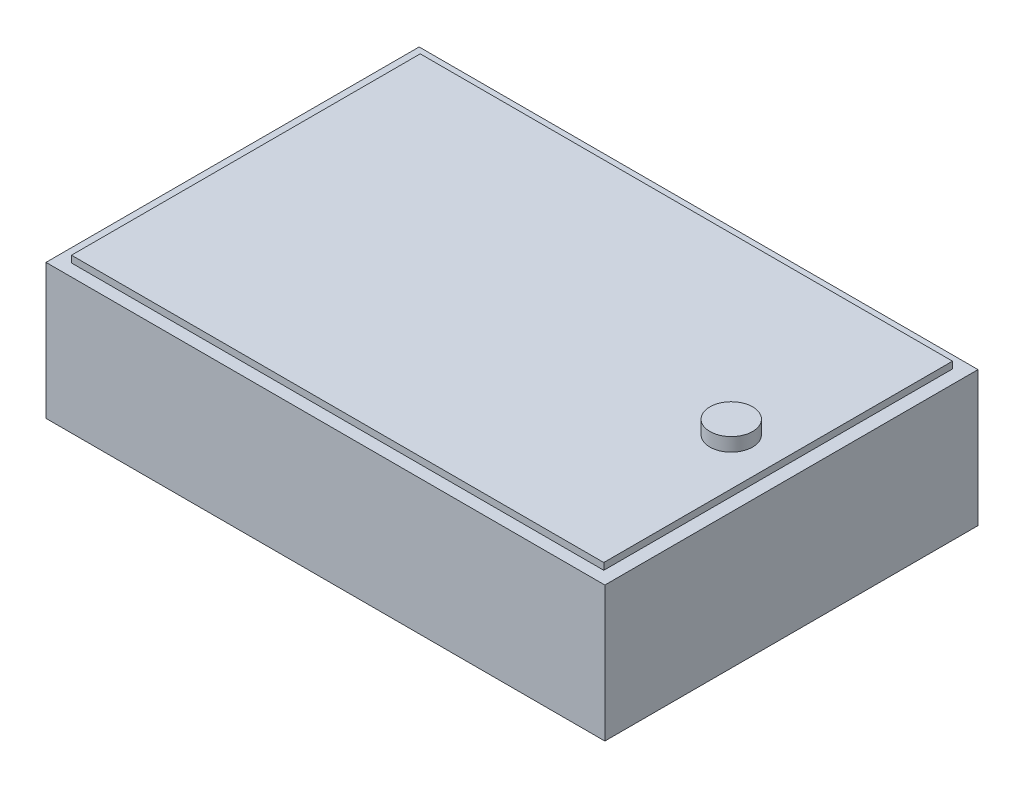
ISO-10303-21;
HEADER;
FILE_DESCRIPTION(('STEP AP214'),'2;1');
FILE_NAME('part.step','',(''),(''),'','','');
FILE_SCHEMA(('AUTOMOTIVE_DESIGN { 1 0 10303 214 1 1 1 1 }'));
ENDSEC;
DATA;
#1=APPLICATION_CONTEXT('core data for automotive mechanical design processes');
#2=APPLICATION_PROTOCOL_DEFINITION('international standard','automotive_design',2000,#1);
#3=PRODUCT_CONTEXT('',#1,'mechanical');
#4=PRODUCT('Part','Part','',(#3));
#5=PRODUCT_RELATED_PRODUCT_CATEGORY('part','',(#4));
#6=PRODUCT_DEFINITION_FORMATION('','',#4);
#7=PRODUCT_DEFINITION_CONTEXT('part definition',#1,'design');
#8=PRODUCT_DEFINITION('design','',#6,#7);
#9=PRODUCT_DEFINITION_SHAPE('','',#8);
#10=(LENGTH_UNIT() NAMED_UNIT(*) SI_UNIT(.MILLI.,.METRE.));
#11=(NAMED_UNIT(*) PLANE_ANGLE_UNIT() SI_UNIT($,.RADIAN.));
#12=(NAMED_UNIT(*) SI_UNIT($,.STERADIAN.) SOLID_ANGLE_UNIT());
#13=UNCERTAINTY_MEASURE_WITH_UNIT(LENGTH_MEASURE(1.E-05),#10,'distance_accuracy_value','');
#14=(GEOMETRIC_REPRESENTATION_CONTEXT(3) GLOBAL_UNCERTAINTY_ASSIGNED_CONTEXT((#13)) GLOBAL_UNIT_ASSIGNED_CONTEXT((#10,
#11,#12)) REPRESENTATION_CONTEXT('',''));
#15=CARTESIAN_POINT('',(0.,0.,0.));
#16=DIRECTION('',(0.,0.,1.));
#17=DIRECTION('',(1.,0.,0.));
#18=AXIS2_PLACEMENT_3D('',#15,#16,#17);
#19=CARTESIAN_POINT('',(124.058723842505,60.,-82.8318918338677));
#20=DIRECTION('',(-1.,0.,0.));
#21=DIRECTION('',(0.,0.,1.));
#22=AXIS2_PLACEMENT_3D('',#19,#20,#21);
#23=PLANE('',#22);
#24=DIRECTION('',(0.,0.,-1.));
#25=VECTOR('',#24,1.);
#26=CARTESIAN_POINT('',(124.058723842505,0.,-82.8318918338677));
#27=LINE('',#26,#25);
#28=CARTESIAN_POINT('',(124.058723842505,0.,82.8318918338677));
#29=VERTEX_POINT('',#28);
#30=CARTESIAN_POINT('',(124.058723842505,0.,-82.8318918338677));
#31=VERTEX_POINT('',#30);
#32=EDGE_CURVE('E127',#29,#31,#27,.T.);
#33=ORIENTED_EDGE('',*,*,#32,.T.);
#34=DIRECTION('',(0.,-1.,0.));
#35=VECTOR('',#34,1.);
#36=CARTESIAN_POINT('',(124.058723842505,60.,-82.8318918338677));
#37=LINE('',#36,#35);
#38=CARTESIAN_POINT('',(124.058723842505,60.,-82.8318918338677));
#39=VERTEX_POINT('',#38);
#40=EDGE_CURVE('E11',#39,#31,#37,.T.);
#41=ORIENTED_EDGE('',*,*,#40,.F.);
#42=DIRECTION('',(0.,0.,-1.));
#43=VECTOR('',#42,1.);
#44=CARTESIAN_POINT('',(124.058723842505,60.,-82.8318918338677));
#45=LINE('',#44,#43);
#46=CARTESIAN_POINT('',(124.058723842505,60.,82.8318918338677));
#47=VERTEX_POINT('',#46);
#48=EDGE_CURVE('E138',#47,#39,#45,.T.);
#49=ORIENTED_EDGE('',*,*,#48,.F.);
#50=DIRECTION('',(0.,-1.,0.));
#51=VECTOR('',#50,1.);
#52=CARTESIAN_POINT('',(124.058723842505,60.,82.8318918338677));
#53=LINE('',#52,#51);
#54=EDGE_CURVE('E151',#47,#29,#53,.T.);
#55=ORIENTED_EDGE('',*,*,#54,.T.);
#56=EDGE_LOOP('',(#33,#41,#49,#55));
#57=FACE_BOUND('',#56,.T.);
#58=ADVANCED_FACE('F39',(#57),#23,.F.);
#59=CARTESIAN_POINT('',(-124.058723842505,60.,-82.8318918338677));
#60=DIRECTION('',(0.,0.,1.));
#61=DIRECTION('',(1.,0.,0.));
#62=AXIS2_PLACEMENT_3D('',#59,#60,#61);
#63=PLANE('',#62);
#64=CARTESIAN_POINT('',(83.9325515101617,31.2050010356045,-82.8318918338677));
#65=DIRECTION('',(0.,0.,-1.));
#66=DIRECTION('',(-1.,0.,0.));
#67=AXIS2_PLACEMENT_3D('',#64,#65,#66);
#68=CIRCLE('',#67,22.6987552041504);
#69=CARTESIAN_POINT('',(61.2337963060113,31.2050010356045,-82.8318918338677));
#70=VERTEX_POINT('',#69);
#71=EDGE_CURVE('E258',#70,#70,#68,.T.);
#72=ORIENTED_EDGE('',*,*,#71,.F.);
#73=EDGE_LOOP('',(#72));
#74=FACE_BOUND('',#73,.T.);
#75=CARTESIAN_POINT('',(0.,31.2050010356045,-82.8318918338677));
#76=DIRECTION('',(0.,0.,-1.));
#77=DIRECTION('',(-1.,0.,0.));
#78=AXIS2_PLACEMENT_3D('',#75,#76,#77);
#79=CIRCLE('',#78,22.8205182682185);
#80=CARTESIAN_POINT('',(-22.8205182682185,31.2050010356045,-82.8318918338677));
#81=VERTEX_POINT('',#80);
#82=EDGE_CURVE('E272',#81,#81,#79,.T.);
#83=ORIENTED_EDGE('',*,*,#82,.F.);
#84=EDGE_LOOP('',(#83));
#85=FACE_BOUND('',#84,.T.);
#86=CARTESIAN_POINT('',(-81.9429672893985,31.2050010356045,-82.8318918338677));
#87=DIRECTION('',(0.,0.,-1.));
#88=DIRECTION('',(-1.,0.,0.));
#89=AXIS2_PLACEMENT_3D('',#86,#87,#88);
#90=CIRCLE('',#89,22.6987552041503);
#91=CARTESIAN_POINT('',(-104.641722493549,31.2050010356045,-82.8318918338677));
#92=VERTEX_POINT('',#91);
#93=EDGE_CURVE('E280',#92,#92,#90,.T.);
#94=ORIENTED_EDGE('',*,*,#93,.F.);
#95=EDGE_LOOP('',(#94));
#96=FACE_BOUND('',#95,.T.);
#97=DIRECTION('',(-1.,0.,0.));
#98=VECTOR('',#97,1.);
#99=CARTESIAN_POINT('',(-124.058723842505,0.,-82.8318918338677));
#100=LINE('',#99,#98);
#101=CARTESIAN_POINT('',(-124.058723842505,0.,-82.8318918338677));
#102=VERTEX_POINT('',#101);
#103=EDGE_CURVE('E132',#31,#102,#100,.T.);
#104=ORIENTED_EDGE('',*,*,#103,.T.);
#105=DIRECTION('',(0.,-1.,0.));
#106=VECTOR('',#105,1.);
#107=CARTESIAN_POINT('',(-124.058723842505,60.,-82.8318918338677));
#108=LINE('',#107,#106);
#109=CARTESIAN_POINT('',(-124.058723842505,60.,-82.8318918338677));
#110=VERTEX_POINT('',#109);
#111=EDGE_CURVE('E47',#110,#102,#108,.T.);
#112=ORIENTED_EDGE('',*,*,#111,.F.);
#113=DIRECTION('',(-1.,0.,0.));
#114=VECTOR('',#113,1.);
#115=CARTESIAN_POINT('',(-124.058723842505,60.,-82.8318918338677));
#116=LINE('',#115,#114);
#117=EDGE_CURVE('E142',#39,#110,#116,.T.);
#118=ORIENTED_EDGE('',*,*,#117,.F.);
#119=ORIENTED_EDGE('',*,*,#40,.T.);
#120=EDGE_LOOP('',(#104,#112,#118,#119));
#121=FACE_BOUND('',#120,.T.);
#122=ADVANCED_FACE('F188',(#74,#85,#96,#121),#63,.F.);
#123=CARTESIAN_POINT('',(-124.058723842505,60.,-82.8318918338677));
#124=DIRECTION('',(1.,0.,0.));
#125=DIRECTION('',(0.,0.,-1.));
#126=AXIS2_PLACEMENT_3D('',#123,#124,#125);
#127=PLANE('',#126);
#128=DIRECTION('',(0.,0.,1.));
#129=VECTOR('',#128,1.);
#130=CARTESIAN_POINT('',(-124.058723842505,0.,-82.8318918338677));
#131=LINE('',#130,#129);
#132=CARTESIAN_POINT('',(-124.058723842505,0.,82.8318918338677));
#133=VERTEX_POINT('',#132);
#134=EDGE_CURVE('E155',#102,#133,#131,.T.);
#135=ORIENTED_EDGE('',*,*,#134,.T.);
#136=DIRECTION('',(0.,-1.,0.));
#137=VECTOR('',#136,1.);
#138=CARTESIAN_POINT('',(-124.058723842505,60.,82.8318918338677));
#139=LINE('',#138,#137);
#140=CARTESIAN_POINT('',(-124.058723842505,60.,82.8318918338677));
#141=VERTEX_POINT('',#140);
#142=EDGE_CURVE('E163',#141,#133,#139,.T.);
#143=ORIENTED_EDGE('',*,*,#142,.F.);
#144=DIRECTION('',(0.,0.,1.));
#145=VECTOR('',#144,1.);
#146=CARTESIAN_POINT('',(-124.058723842505,60.,-82.8318918338677));
#147=LINE('',#146,#145);
#148=EDGE_CURVE('E146',#110,#141,#147,.T.);
#149=ORIENTED_EDGE('',*,*,#148,.F.);
#150=ORIENTED_EDGE('',*,*,#111,.T.);
#151=EDGE_LOOP('',(#135,#143,#149,#150));
#152=FACE_BOUND('',#151,.T.);
#153=ADVANCED_FACE('F172',(#152),#127,.F.);
#154=CARTESIAN_POINT('',(-124.058723842505,60.,82.8318918338677));
#155=DIRECTION('',(0.,0.,-1.));
#156=DIRECTION('',(-1.,0.,0.));
#157=AXIS2_PLACEMENT_3D('',#154,#155,#156);
#158=PLANE('',#157);
#159=DIRECTION('',(1.,0.,0.));
#160=VECTOR('',#159,1.);
#161=CARTESIAN_POINT('',(-124.058723842505,0.,82.8318918338677));
#162=LINE('',#161,#160);
#163=EDGE_CURVE('E143',#133,#29,#162,.T.);
#164=ORIENTED_EDGE('',*,*,#163,.T.);
#165=ORIENTED_EDGE('',*,*,#54,.F.);
#166=DIRECTION('',(1.,0.,0.));
#167=VECTOR('',#166,1.);
#168=CARTESIAN_POINT('',(-124.058723842505,60.,82.8318918338677));
#169=LINE('',#168,#167);
#170=EDGE_CURVE('E149',#141,#47,#169,.T.);
#171=ORIENTED_EDGE('',*,*,#170,.F.);
#172=ORIENTED_EDGE('',*,*,#142,.T.);
#173=EDGE_LOOP('',(#164,#165,#171,#172));
#174=FACE_BOUND('',#173,.T.);
#175=ADVANCED_FACE('F181',(#174),#158,.F.);
#176=CARTESIAN_POINT('',(0.,60.,0.));
#177=DIRECTION('',(0.,1.,0.));
#178=DIRECTION('',(0.,0.,1.));
#179=AXIS2_PLACEMENT_3D('',#176,#177,#178);
#180=PLANE('',#179);
#181=DIRECTION('',(0.,0.,-1.));
#182=VECTOR('',#181,1.);
#183=CARTESIAN_POINT('',(118.158183771387,60.,-77.4139824709087));
#184=LINE('',#183,#182);
#185=CARTESIAN_POINT('',(118.158183771387,60.,77.4139824709087));
#186=VERTEX_POINT('',#185);
#187=CARTESIAN_POINT('',(118.158183771387,60.,-77.4139824709087));
#188=VERTEX_POINT('',#187);
#189=EDGE_CURVE('E54',#186,#188,#184,.T.);
#190=ORIENTED_EDGE('',*,*,#189,.F.);
#191=DIRECTION('',(1.,0.,0.));
#192=VECTOR('',#191,1.);
#193=CARTESIAN_POINT('',(-118.158183771387,60.,77.4139824709087));
#194=LINE('',#193,#192);
#195=CARTESIAN_POINT('',(-118.158183771387,60.,77.4139824709087));
#196=VERTEX_POINT('',#195);
#197=EDGE_CURVE('E58',#196,#186,#194,.T.);
#198=ORIENTED_EDGE('',*,*,#197,.F.);
#199=DIRECTION('',(0.,0.,1.));
#200=VECTOR('',#199,1.);
#201=CARTESIAN_POINT('',(-118.158183771387,60.,-77.4139824709087));
#202=LINE('',#201,#200);
#203=CARTESIAN_POINT('',(-118.158183771387,60.,-77.4139824709087));
#204=VERTEX_POINT('',#203);
#205=EDGE_CURVE('E297',#204,#196,#202,.T.);
#206=ORIENTED_EDGE('',*,*,#205,.F.);
#207=DIRECTION('',(-1.,0.,0.));
#208=VECTOR('',#207,1.);
#209=CARTESIAN_POINT('',(-118.158183771387,60.,-77.4139824709087));
#210=LINE('',#209,#208);
#211=EDGE_CURVE('E294',#188,#204,#210,.T.);
#212=ORIENTED_EDGE('',*,*,#211,.F.);
#213=EDGE_LOOP('',(#190,#198,#206,#212));
#214=FACE_BOUND('',#213,.T.);
#215=ORIENTED_EDGE('',*,*,#48,.T.);
#216=ORIENTED_EDGE('',*,*,#117,.T.);
#217=ORIENTED_EDGE('',*,*,#148,.T.);
#218=ORIENTED_EDGE('',*,*,#170,.T.);
#219=EDGE_LOOP('',(#215,#216,#217,#218));
#220=FACE_BOUND('',#219,.T.);
#221=ADVANCED_FACE('F187',(#214,#220),#180,.T.);
#222=CARTESIAN_POINT('',(0.,0.,0.));
#223=DIRECTION('',(0.,1.,0.));
#224=DIRECTION('',(0.,0.,1.));
#225=AXIS2_PLACEMENT_3D('',#222,#223,#224);
#226=PLANE('',#225);
#227=ORIENTED_EDGE('',*,*,#32,.F.);
#228=ORIENTED_EDGE('',*,*,#163,.F.);
#229=ORIENTED_EDGE('',*,*,#134,.F.);
#230=ORIENTED_EDGE('',*,*,#103,.F.);
#231=EDGE_LOOP('',(#227,#228,#229,#230));
#232=FACE_BOUND('',#231,.T.);
#233=ADVANCED_FACE('F178',(#232),#226,.F.);
#234=CARTESIAN_POINT('',(118.158183771387,63.,-77.4139824709087));
#235=DIRECTION('',(-1.,0.,0.));
#236=DIRECTION('',(0.,0.,1.));
#237=AXIS2_PLACEMENT_3D('',#234,#235,#236);
#238=PLANE('',#237);
#239=ORIENTED_EDGE('',*,*,#189,.T.);
#240=DIRECTION('',(0.,-1.,0.));
#241=VECTOR('',#240,1.);
#242=CARTESIAN_POINT('',(118.158183771387,63.,-77.4139824709087));
#243=LINE('',#242,#241);
#244=CARTESIAN_POINT('',(118.158183771387,63.,-77.4139824709087));
#245=VERTEX_POINT('',#244);
#246=EDGE_CURVE('E107',#245,#188,#243,.T.);
#247=ORIENTED_EDGE('',*,*,#246,.F.);
#248=DIRECTION('',(0.,0.,-1.));
#249=VECTOR('',#248,1.);
#250=CARTESIAN_POINT('',(118.158183771387,63.,-77.4139824709087));
#251=LINE('',#250,#249);
#252=CARTESIAN_POINT('',(118.158183771387,63.,77.4139824709087));
#253=VERTEX_POINT('',#252);
#254=EDGE_CURVE('E114',#253,#245,#251,.T.);
#255=ORIENTED_EDGE('',*,*,#254,.F.);
#256=DIRECTION('',(0.,-1.,0.));
#257=VECTOR('',#256,1.);
#258=CARTESIAN_POINT('',(118.158183771387,63.,77.4139824709087));
#259=LINE('',#258,#257);
#260=EDGE_CURVE('E291',#253,#186,#259,.T.);
#261=ORIENTED_EDGE('',*,*,#260,.T.);
#262=EDGE_LOOP('',(#239,#247,#255,#261));
#263=FACE_BOUND('',#262,.T.);
#264=ADVANCED_FACE('F125',(#263),#238,.F.);
#265=CARTESIAN_POINT('',(-118.158183771387,63.,-77.4139824709087));
#266=DIRECTION('',(0.,0.,1.));
#267=DIRECTION('',(1.,0.,0.));
#268=AXIS2_PLACEMENT_3D('',#265,#266,#267);
#269=PLANE('',#268);
#270=ORIENTED_EDGE('',*,*,#211,.T.);
#271=DIRECTION('',(0.,-1.,0.));
#272=VECTOR('',#271,1.);
#273=CARTESIAN_POINT('',(-118.158183771387,63.,-77.4139824709087));
#274=LINE('',#273,#272);
#275=CARTESIAN_POINT('',(-118.158183771387,63.,-77.4139824709087));
#276=VERTEX_POINT('',#275);
#277=EDGE_CURVE('E109',#276,#204,#274,.T.);
#278=ORIENTED_EDGE('',*,*,#277,.F.);
#279=DIRECTION('',(-1.,0.,0.));
#280=VECTOR('',#279,1.);
#281=CARTESIAN_POINT('',(-118.158183771387,63.,-77.4139824709087));
#282=LINE('',#281,#280);
#283=EDGE_CURVE('E102',#245,#276,#282,.T.);
#284=ORIENTED_EDGE('',*,*,#283,.F.);
#285=ORIENTED_EDGE('',*,*,#246,.T.);
#286=EDGE_LOOP('',(#270,#278,#284,#285));
#287=FACE_BOUND('',#286,.T.);
#288=ADVANCED_FACE('F105',(#287),#269,.F.);
#289=CARTESIAN_POINT('',(-118.158183771387,63.,-77.4139824709087));
#290=DIRECTION('',(1.,0.,0.));
#291=DIRECTION('',(0.,0.,-1.));
#292=AXIS2_PLACEMENT_3D('',#289,#290,#291);
#293=PLANE('',#292);
#294=ORIENTED_EDGE('',*,*,#205,.T.);
#295=DIRECTION('',(0.,-1.,0.));
#296=VECTOR('',#295,1.);
#297=CARTESIAN_POINT('',(-118.158183771387,63.,77.4139824709087));
#298=LINE('',#297,#296);
#299=CARTESIAN_POINT('',(-118.158183771387,63.,77.4139824709087));
#300=VERTEX_POINT('',#299);
#301=EDGE_CURVE('E134',#300,#196,#298,.T.);
#302=ORIENTED_EDGE('',*,*,#301,.F.);
#303=DIRECTION('',(0.,0.,1.));
#304=VECTOR('',#303,1.);
#305=CARTESIAN_POINT('',(-118.158183771387,63.,-77.4139824709087));
#306=LINE('',#305,#304);
#307=EDGE_CURVE('E113',#276,#300,#306,.T.);
#308=ORIENTED_EDGE('',*,*,#307,.F.);
#309=ORIENTED_EDGE('',*,*,#277,.T.);
#310=EDGE_LOOP('',(#294,#302,#308,#309));
#311=FACE_BOUND('',#310,.T.);
#312=ADVANCED_FACE('F209',(#311),#293,.F.);
#313=CARTESIAN_POINT('',(-118.158183771387,63.,77.4139824709087));
#314=DIRECTION('',(0.,0.,-1.));
#315=DIRECTION('',(-1.,0.,0.));
#316=AXIS2_PLACEMENT_3D('',#313,#314,#315);
#317=PLANE('',#316);
#318=ORIENTED_EDGE('',*,*,#197,.T.);
#319=ORIENTED_EDGE('',*,*,#260,.F.);
#320=DIRECTION('',(1.,0.,0.));
#321=VECTOR('',#320,1.);
#322=CARTESIAN_POINT('',(-118.158183771387,63.,77.4139824709087));
#323=LINE('',#322,#321);
#324=EDGE_CURVE('E119',#300,#253,#323,.T.);
#325=ORIENTED_EDGE('',*,*,#324,.F.);
#326=ORIENTED_EDGE('',*,*,#301,.T.);
#327=EDGE_LOOP('',(#318,#319,#325,#326));
#328=FACE_BOUND('',#327,.T.);
#329=ADVANCED_FACE('F212',(#328),#317,.F.);
#330=CARTESIAN_POINT('',(0.,63.,0.));
#331=DIRECTION('',(0.,1.,0.));
#332=DIRECTION('',(0.,0.,1.));
#333=AXIS2_PLACEMENT_3D('',#330,#331,#332);
#334=PLANE('',#333);
#335=CARTESIAN_POINT('',(97.3432834156218,63.,0.));
#336=DIRECTION('',(0.,1.,0.));
#337=DIRECTION('',(0.,0.,1.));
#338=AXIS2_PLACEMENT_3D('',#335,#336,#337);
#339=CIRCLE('',#338,9.48321580994399);
#340=CARTESIAN_POINT('',(97.3432834156218,63.,9.48321580994399));
#341=VERTEX_POINT('',#340);
#342=EDGE_CURVE('E257',#341,#341,#339,.T.);
#343=ORIENTED_EDGE('',*,*,#342,.F.);
#344=EDGE_LOOP('',(#343));
#345=FACE_BOUND('',#344,.T.);
#346=ORIENTED_EDGE('',*,*,#254,.T.);
#347=ORIENTED_EDGE('',*,*,#283,.T.);
#348=ORIENTED_EDGE('',*,*,#307,.T.);
#349=ORIENTED_EDGE('',*,*,#324,.T.);
#350=EDGE_LOOP('',(#346,#347,#348,#349));
#351=FACE_BOUND('',#350,.T.);
#352=ADVANCED_FACE('F117',(#345,#351),#334,.T.);
#353=CARTESIAN_POINT('',(97.3432834156218,69.,0.));
#354=DIRECTION('',(0.,-1.,0.));
#355=DIRECTION('',(0.,0.,-1.));
#356=AXIS2_PLACEMENT_3D('',#353,#354,#355);
#357=CYLINDRICAL_SURFACE('',#356,9.48321580994399);
#358=CARTESIAN_POINT('',(97.3432834156218,69.,0.));
#359=DIRECTION('',(0.,1.,0.));
#360=DIRECTION('',(0.,0.,1.));
#361=AXIS2_PLACEMENT_3D('',#358,#359,#360);
#362=CIRCLE('',#361,9.48321580994399);
#363=CARTESIAN_POINT('',(97.3432834156218,69.,9.48321580994399));
#364=VERTEX_POINT('',#363);
#365=EDGE_CURVE('E263',#364,#364,#362,.T.);
#366=ORIENTED_EDGE('',*,*,#365,.F.);
#367=EDGE_LOOP('',(#366));
#368=FACE_BOUND('',#367,.T.);
#369=ORIENTED_EDGE('',*,*,#342,.T.);
#370=EDGE_LOOP('',(#369));
#371=FACE_BOUND('',#370,.T.);
#372=ADVANCED_FACE('F219',(#368,#371),#357,.T.);
#373=CARTESIAN_POINT('',(97.3432834156218,69.,0.));
#374=DIRECTION('',(0.,1.,0.));
#375=DIRECTION('',(0.,0.,1.));
#376=AXIS2_PLACEMENT_3D('',#373,#374,#375);
#377=PLANE('',#376);
#378=ORIENTED_EDGE('',*,*,#365,.T.);
#379=EDGE_LOOP('',(#378));
#380=FACE_BOUND('',#379,.T.);
#381=ADVANCED_FACE('F223',(#380),#377,.T.);
#382=CARTESIAN_POINT('',(-81.9429672893985,31.2050010356045,-67.8318918338677));
#383=DIRECTION('',(0.,0.,-1.));
#384=DIRECTION('',(-1.,0.,0.));
#385=AXIS2_PLACEMENT_3D('',#382,#383,#384);
#386=CYLINDRICAL_SURFACE('',#385,22.6987552041503);
#387=CARTESIAN_POINT('',(-81.9429672893985,31.2050010356045,-67.8318918338677));
#388=DIRECTION('',(0.,0.,-1.));
#389=DIRECTION('',(-1.,0.,0.));
#390=AXIS2_PLACEMENT_3D('',#387,#388,#389);
#391=CIRCLE('',#390,22.6987552041503);
#392=CARTESIAN_POINT('',(-104.641722493549,31.2050010356045,-67.8318918338677));
#393=VERTEX_POINT('',#392);
#394=EDGE_CURVE('E276',#393,#393,#391,.T.);
#395=ORIENTED_EDGE('',*,*,#394,.F.);
#396=EDGE_LOOP('',(#395));
#397=FACE_BOUND('',#396,.T.);
#398=ORIENTED_EDGE('',*,*,#93,.T.);
#399=EDGE_LOOP('',(#398));
#400=FACE_BOUND('',#399,.T.);
#401=ADVANCED_FACE('F227',(#397,#400),#386,.F.);
#402=CARTESIAN_POINT('',(-81.9429672893985,31.2050010356045,-67.8318918338677));
#403=DIRECTION('',(0.,0.,-1.));
#404=DIRECTION('',(-1.,0.,0.));
#405=AXIS2_PLACEMENT_3D('',#402,#403,#404);
#406=PLANE('',#405);
#407=ORIENTED_EDGE('',*,*,#394,.T.);
#408=EDGE_LOOP('',(#407));
#409=FACE_BOUND('',#408,.T.);
#410=ADVANCED_FACE('F231',(#409),#406,.T.);
#411=CARTESIAN_POINT('',(0.,31.2050010356045,-67.8318918338677));
#412=DIRECTION('',(0.,0.,-1.));
#413=DIRECTION('',(-1.,0.,0.));
#414=AXIS2_PLACEMENT_3D('',#411,#412,#413);
#415=CYLINDRICAL_SURFACE('',#414,22.8205182682185);
#416=CARTESIAN_POINT('',(0.,31.2050010356045,-67.8318918338677));
#417=DIRECTION('',(0.,0.,-1.));
#418=DIRECTION('',(-1.,0.,0.));
#419=AXIS2_PLACEMENT_3D('',#416,#417,#418);
#420=CIRCLE('',#419,22.8205182682185);
#421=CARTESIAN_POINT('',(-22.8205182682185,31.2050010356045,-67.8318918338677));
#422=VERTEX_POINT('',#421);
#423=EDGE_CURVE('E266',#422,#422,#420,.T.);
#424=ORIENTED_EDGE('',*,*,#423,.F.);
#425=EDGE_LOOP('',(#424));
#426=FACE_BOUND('',#425,.T.);
#427=ORIENTED_EDGE('',*,*,#82,.T.);
#428=EDGE_LOOP('',(#427));
#429=FACE_BOUND('',#428,.T.);
#430=ADVANCED_FACE('F235',(#426,#429),#415,.F.);
#431=CARTESIAN_POINT('',(0.,31.2050010356045,-67.8318918338677));
#432=DIRECTION('',(0.,0.,-1.));
#433=DIRECTION('',(-1.,0.,0.));
#434=AXIS2_PLACEMENT_3D('',#431,#432,#433);
#435=PLANE('',#434);
#436=ORIENTED_EDGE('',*,*,#423,.T.);
#437=EDGE_LOOP('',(#436));
#438=FACE_BOUND('',#437,.T.);
#439=ADVANCED_FACE('F239',(#438),#435,.T.);
#440=CARTESIAN_POINT('',(83.9325515101617,31.2050010356045,-67.8318918338677));
#441=DIRECTION('',(0.,0.,-1.));
#442=DIRECTION('',(-1.,0.,0.));
#443=AXIS2_PLACEMENT_3D('',#440,#441,#442);
#444=CYLINDRICAL_SURFACE('',#443,22.6987552041504);
#445=CARTESIAN_POINT('',(83.9325515101617,31.2050010356045,-67.8318918338677));
#446=DIRECTION('',(0.,0.,-1.));
#447=DIRECTION('',(-1.,0.,0.));
#448=AXIS2_PLACEMENT_3D('',#445,#446,#447);
#449=CIRCLE('',#448,22.6987552041504);
#450=CARTESIAN_POINT('',(61.2337963060113,31.2050010356045,-67.8318918338677));
#451=VERTEX_POINT('',#450);
#452=EDGE_CURVE('E255',#451,#451,#449,.T.);
#453=ORIENTED_EDGE('',*,*,#452,.F.);
#454=EDGE_LOOP('',(#453));
#455=FACE_BOUND('',#454,.T.);
#456=ORIENTED_EDGE('',*,*,#71,.T.);
#457=EDGE_LOOP('',(#456));
#458=FACE_BOUND('',#457,.T.);
#459=ADVANCED_FACE('F243',(#455,#458),#444,.F.);
#460=CARTESIAN_POINT('',(83.9325515101617,31.2050010356045,-67.8318918338677));
#461=DIRECTION('',(0.,0.,-1.));
#462=DIRECTION('',(-1.,0.,0.));
#463=AXIS2_PLACEMENT_3D('',#460,#461,#462);
#464=PLANE('',#463);
#465=ORIENTED_EDGE('',*,*,#452,.T.);
#466=EDGE_LOOP('',(#465));
#467=FACE_BOUND('',#466,.T.);
#468=ADVANCED_FACE('F247',(#467),#464,.T.);
#469=CLOSED_SHELL('',(#58,#122,#153,#175,#221,#233,#264,#288,#312,#329,#352,#372,#381,#401,#410,
#430,#439,#459,#468));
#470=MANIFOLD_SOLID_BREP('B2',#469);
#471=ADVANCED_BREP_SHAPE_REPRESENTATION('',(#18,#470),#14);
#472=SHAPE_DEFINITION_REPRESENTATION(#9,#471);
ENDSEC;
END-ISO-10303-21;
